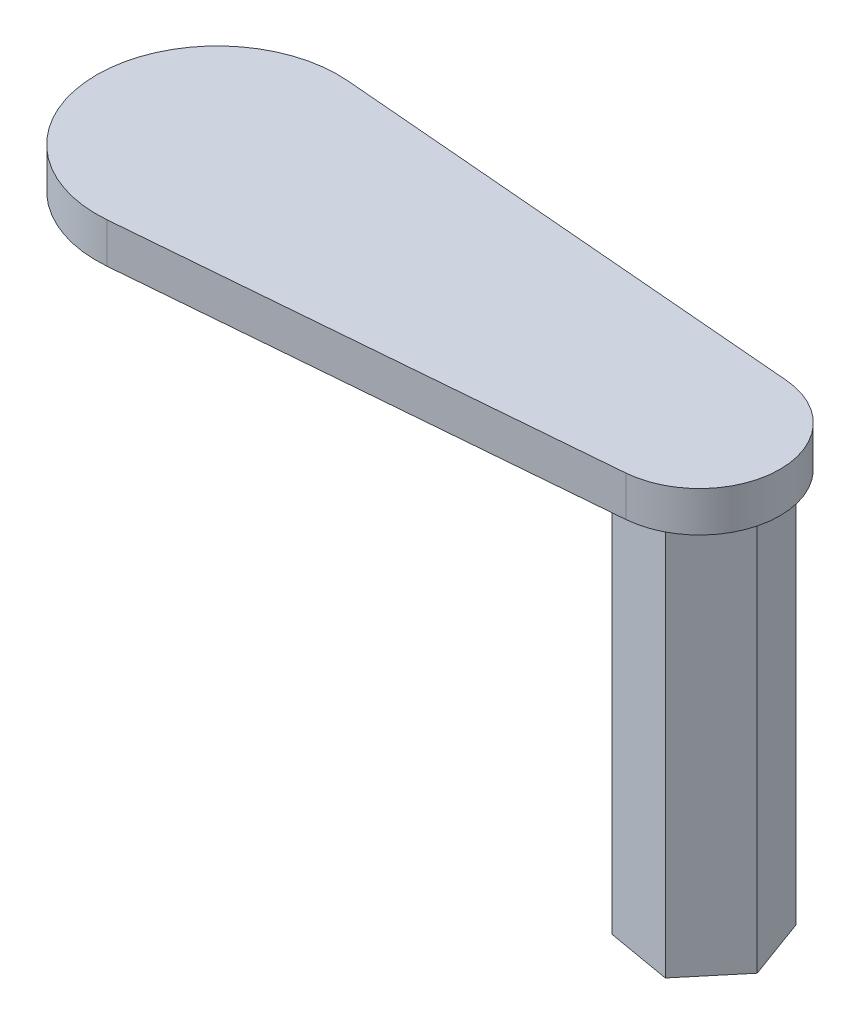
ISO-10303-21;
HEADER;
FILE_DESCRIPTION(('STEP AP214'),'2;1');
FILE_NAME('part.step','',(''),(''),'','','');
FILE_SCHEMA(('AUTOMOTIVE_DESIGN { 1 0 10303 214 1 1 1 1 }'));
ENDSEC;
DATA;
#1=APPLICATION_CONTEXT('core data for automotive mechanical design processes');
#2=APPLICATION_PROTOCOL_DEFINITION('international standard','automotive_design',2000,#1);
#3=PRODUCT_CONTEXT('',#1,'mechanical');
#4=PRODUCT('Part','Part','',(#3));
#5=PRODUCT_RELATED_PRODUCT_CATEGORY('part','',(#4));
#6=PRODUCT_DEFINITION_FORMATION('','',#4);
#7=PRODUCT_DEFINITION_CONTEXT('part definition',#1,'design');
#8=PRODUCT_DEFINITION('design','',#6,#7);
#9=PRODUCT_DEFINITION_SHAPE('','',#8);
#10=(LENGTH_UNIT() NAMED_UNIT(*) SI_UNIT(.MILLI.,.METRE.));
#11=(NAMED_UNIT(*) PLANE_ANGLE_UNIT() SI_UNIT($,.RADIAN.));
#12=(NAMED_UNIT(*) SI_UNIT($,.STERADIAN.) SOLID_ANGLE_UNIT());
#13=UNCERTAINTY_MEASURE_WITH_UNIT(LENGTH_MEASURE(1.E-05),#10,'distance_accuracy_value','');
#14=(GEOMETRIC_REPRESENTATION_CONTEXT(3) GLOBAL_UNCERTAINTY_ASSIGNED_CONTEXT((#13)) GLOBAL_UNIT_ASSIGNED_CONTEXT((#10,
#11,#12)) REPRESENTATION_CONTEXT('',''));
#15=CARTESIAN_POINT('',(0.,0.,0.));
#16=DIRECTION('',(0.,0.,1.));
#17=DIRECTION('',(1.,0.,0.));
#18=AXIS2_PLACEMENT_3D('',#15,#16,#17);
#19=CARTESIAN_POINT('',(0.,0.,0.));
#20=DIRECTION('',(0.,1.,0.));
#21=DIRECTION('',(0.,0.,1.));
#22=AXIS2_PLACEMENT_3D('',#19,#20,#21);
#23=PLANE('',#22);
#24=CARTESIAN_POINT('',(0.,0.,0.));
#25=DIRECTION('',(0.,1.,0.));
#26=DIRECTION('',(0.,0.,1.));
#27=AXIS2_PLACEMENT_3D('',#24,#25,#26);
#28=CIRCLE('',#27,15.);
#29=CARTESIAN_POINT('',(1.25283524217713,0.,-14.9475885632419));
#30=VERTEX_POINT('',#29);
#31=CARTESIAN_POINT('',(1.25283524217713,0.,14.9475885632419));
#32=VERTEX_POINT('',#31);
#33=EDGE_CURVE('E156',#30,#32,#28,.T.);
#34=ORIENTED_EDGE('',*,*,#33,.F.);
#35=DIRECTION('',(0.996505904216124,0.,0.0835223494784752));
#36=VECTOR('',#35,1.);
#37=CARTESIAN_POINT('',(1.25283524217713,0.,-14.9475885632419));
#38=LINE('',#37,#36);
#39=CARTESIAN_POINT('',(60.6994398538871,0.,-9.96505904216124));
#40=VERTEX_POINT('',#39);
#41=EDGE_CURVE('E146',#30,#40,#38,.T.);
#42=ORIENTED_EDGE('',*,*,#41,.T.);
#43=CARTESIAN_POINT('',(59.8642163591023,0.,0.));
#44=DIRECTION('',(0.,1.,0.));
#45=DIRECTION('',(0.,0.,1.));
#46=AXIS2_PLACEMENT_3D('',#43,#44,#45);
#47=CIRCLE('',#46,9.99999999999999);
#48=CARTESIAN_POINT('',(60.6994398538871,0.,9.96505904216125));
#49=VERTEX_POINT('',#48);
#50=EDGE_CURVE('E161',#49,#40,#47,.T.);
#51=ORIENTED_EDGE('',*,*,#50,.F.);
#52=DIRECTION('',(0.996505904216124,0.,-0.0835223494784752));
#53=VECTOR('',#52,1.);
#54=CARTESIAN_POINT('',(1.25283524217713,0.,14.9475885632419));
#55=LINE('',#54,#53);
#56=EDGE_CURVE('E159',#32,#49,#55,.T.);
#57=ORIENTED_EDGE('',*,*,#56,.F.);
#58=EDGE_LOOP('',(#34,#42,#51,#57));
#59=FACE_BOUND('',#58,.T.);
#60=CARTESIAN_POINT('',(0.,0.,0.));
#61=DIRECTION('',(0.,1.,0.));
#62=DIRECTION('',(0.,0.,1.));
#63=AXIS2_PLACEMENT_3D('',#60,#61,#62);
#64=CIRCLE('',#63,8.5);
#65=CARTESIAN_POINT('',(0.,0.,8.5));
#66=VERTEX_POINT('',#65);
#67=EDGE_CURVE('E136',#66,#66,#64,.T.);
#68=ORIENTED_EDGE('',*,*,#67,.T.);
#69=EDGE_LOOP('',(#68));
#70=FACE_BOUND('',#69,.T.);
#71=DIRECTION('',(-0.34448959790477,0.,-0.93879013466025));
#72=VECTOR('',#71,1.);
#73=CARTESIAN_POINT('',(46.2477825898024,0.,-16.9706513097456));
#74=LINE('',#73,#72);
#75=CARTESIAN_POINT('',(54.4721610690567,0.,5.44211652706548));
#76=VERTEX_POINT('',#75);
#77=CARTESIAN_POINT('',(51.6817312187925,0.,-2.16225826631702));
#78=VERTEX_POINT('',#77);
#79=EDGE_CURVE('E132',#76,#78,#74,.T.);
#80=ORIENTED_EDGE('',*,*,#79,.F.);
#81=DIRECTION('',(-0.985260904390375,0.,-0.171058324205109));
#82=VECTOR('',#81,1.);
#83=CARTESIAN_POINT('',(0.676708772487052,0.,-3.89770389887627));
#84=LINE('',#83,#82);
#85=CARTESIAN_POINT('',(62.4529577451561,0.,6.82772078594953));
#86=VERTEX_POINT('',#85);
#87=EDGE_CURVE('E129',#86,#76,#84,.T.);
#88=ORIENTED_EDGE('',*,*,#87,.F.);
#89=DIRECTION('',(-0.640771306485607,0.,0.767731810455141));
#90=VECTOR('',#89,1.);
#91=CARTESIAN_POINT('',(40.1693635044773,0.,33.5265195253534));
#92=LINE('',#91,#90);
#93=CARTESIAN_POINT('',(67.6433245709913,0.,0.608950251451065));
#94=VERTEX_POINT('',#93);
#95=EDGE_CURVE('E346',#94,#86,#92,.T.);
#96=ORIENTED_EDGE('',*,*,#95,.F.);
#97=DIRECTION('',(0.34448959790477,0.,0.93879013466025));
#98=VECTOR('',#97,1.);
#99=CARTESIAN_POINT('',(59.418946091737,0.,-21.80381758536));
#100=LINE('',#99,#98);
#101=CARTESIAN_POINT('',(64.8528947207271,0.,-6.99542454193145));
#102=VERTEX_POINT('',#101);
#103=EDGE_CURVE('E361',#102,#94,#100,.T.);
#104=ORIENTED_EDGE('',*,*,#103,.F.);
#105=DIRECTION('',(0.985260904390375,0.,0.171058324205107));
#106=VECTOR('',#105,1.);
#107=CARTESIAN_POINT('',(3.07664574805803,0.,-17.7208492267572));
#108=LINE('',#107,#106);
#109=CARTESIAN_POINT('',(56.8720980446277,0.,-8.3810288008155));
#110=VERTEX_POINT('',#109);
#111=EDGE_CURVE('E55',#110,#102,#108,.T.);
#112=ORIENTED_EDGE('',*,*,#111,.F.);
#113=DIRECTION('',(0.640771306485605,0.,-0.767731810455143));
#114=VECTOR('',#113,1.);
#115=CARTESIAN_POINT('',(29.3981369781139,0.,24.5365404730868));
#116=LINE('',#115,#114);
#117=EDGE_CURVE('E50',#78,#110,#116,.T.);
#118=ORIENTED_EDGE('',*,*,#117,.F.);
#119=EDGE_LOOP('',(#80,#88,#96,#104,#112,#118));
#120=FACE_BOUND('',#119,.T.);
#121=ADVANCED_FACE('F35',(#59,#70,#120),#23,.F.);
#122=CARTESIAN_POINT('',(0.,5.,0.));
#123=DIRECTION('',(0.,-1.,0.));
#124=DIRECTION('',(0.,0.,-1.));
#125=AXIS2_PLACEMENT_3D('',#122,#123,#124);
#126=CYLINDRICAL_SURFACE('',#125,8.5);
#127=ORIENTED_EDGE('',*,*,#67,.F.);
#128=EDGE_LOOP('',(#127));
#129=FACE_BOUND('',#128,.T.);
#130=CARTESIAN_POINT('',(0.,2.,0.));
#131=DIRECTION('',(0.,1.,0.));
#132=DIRECTION('',(0.,0.,1.));
#133=AXIS2_PLACEMENT_3D('',#130,#131,#132);
#134=CIRCLE('',#133,8.5);
#135=CARTESIAN_POINT('',(0.,2.,8.5));
#136=VERTEX_POINT('',#135);
#137=EDGE_CURVE('E133',#136,#136,#134,.T.);
#138=ORIENTED_EDGE('',*,*,#137,.T.);
#139=EDGE_LOOP('',(#138));
#140=FACE_BOUND('',#139,.T.);
#141=ADVANCED_FACE('F37',(#129,#140),#126,.F.);
#142=CARTESIAN_POINT('',(0.,5.,0.));
#143=DIRECTION('',(0.,-1.,0.));
#144=DIRECTION('',(0.,0.,-1.));
#145=AXIS2_PLACEMENT_3D('',#142,#143,#144);
#146=CYLINDRICAL_SURFACE('',#145,15.);
#147=ORIENTED_EDGE('',*,*,#33,.T.);
#148=DIRECTION('',(0.,-1.,0.));
#149=VECTOR('',#148,1.);
#150=CARTESIAN_POINT('',(1.25283524217713,5.,14.9475885632419));
#151=LINE('',#150,#149);
#152=CARTESIAN_POINT('',(1.25283524217713,5.,14.9475885632419));
#153=VERTEX_POINT('',#152);
#154=EDGE_CURVE('E11',#153,#32,#151,.T.);
#155=ORIENTED_EDGE('',*,*,#154,.F.);
#156=CARTESIAN_POINT('',(0.,5.,0.));
#157=DIRECTION('',(0.,1.,0.));
#158=DIRECTION('',(0.,0.,1.));
#159=AXIS2_PLACEMENT_3D('',#156,#157,#158);
#160=CIRCLE('',#159,15.);
#161=CARTESIAN_POINT('',(1.25283524217713,5.,-14.9475885632419));
#162=VERTEX_POINT('',#161);
#163=EDGE_CURVE('E142',#162,#153,#160,.T.);
#164=ORIENTED_EDGE('',*,*,#163,.F.);
#165=DIRECTION('',(0.,-1.,0.));
#166=VECTOR('',#165,1.);
#167=CARTESIAN_POINT('',(1.25283524217713,5.,-14.9475885632419));
#168=LINE('',#167,#166);
#169=EDGE_CURVE('E153',#162,#30,#168,.T.);
#170=ORIENTED_EDGE('',*,*,#169,.T.);
#171=EDGE_LOOP('',(#147,#155,#164,#170));
#172=FACE_BOUND('',#171,.T.);
#173=ADVANCED_FACE('F189',(#172),#146,.T.);
#174=CARTESIAN_POINT('',(1.25283524217713,5.,14.9475885632419));
#175=DIRECTION('',(-0.0835223494784752,0.,-0.996505904216124));
#176=DIRECTION('',(-0.996505904216124,0.,0.0835223494784752));
#177=AXIS2_PLACEMENT_3D('',#174,#175,#176);
#178=PLANE('',#177);
#179=ORIENTED_EDGE('',*,*,#56,.T.);
#180=DIRECTION('',(0.,-1.,0.));
#181=VECTOR('',#180,1.);
#182=CARTESIAN_POINT('',(60.6994398538871,5.,9.96505904216125));
#183=LINE('',#182,#181);
#184=CARTESIAN_POINT('',(60.6994398538871,5.,9.96505904216125));
#185=VERTEX_POINT('',#184);
#186=EDGE_CURVE('E43',#185,#49,#183,.T.);
#187=ORIENTED_EDGE('',*,*,#186,.F.);
#188=DIRECTION('',(0.996505904216124,0.,-0.0835223494784752));
#189=VECTOR('',#188,1.);
#190=CARTESIAN_POINT('',(1.25283524217713,5.,14.9475885632419));
#191=LINE('',#190,#189);
#192=EDGE_CURVE('E145',#153,#185,#191,.T.);
#193=ORIENTED_EDGE('',*,*,#192,.F.);
#194=ORIENTED_EDGE('',*,*,#154,.T.);
#195=EDGE_LOOP('',(#179,#187,#193,#194));
#196=FACE_BOUND('',#195,.T.);
#197=ADVANCED_FACE('F187',(#196),#178,.F.);
#198=CARTESIAN_POINT('',(59.8642163591023,5.,0.));
#199=DIRECTION('',(0.,-1.,0.));
#200=DIRECTION('',(0.,0.,-1.));
#201=AXIS2_PLACEMENT_3D('',#198,#199,#200);
#202=CYLINDRICAL_SURFACE('',#201,9.99999999999999);
#203=ORIENTED_EDGE('',*,*,#50,.T.);
#204=DIRECTION('',(0.,-1.,0.));
#205=VECTOR('',#204,1.);
#206=CARTESIAN_POINT('',(60.6994398538871,5.,-9.96505904216124));
#207=LINE('',#206,#205);
#208=CARTESIAN_POINT('',(60.6994398538871,5.,-9.96505904216124));
#209=VERTEX_POINT('',#208);
#210=EDGE_CURVE('E167',#209,#40,#207,.T.);
#211=ORIENTED_EDGE('',*,*,#210,.F.);
#212=CARTESIAN_POINT('',(59.8642163591023,5.,0.));
#213=DIRECTION('',(0.,1.,0.));
#214=DIRECTION('',(0.,0.,1.));
#215=AXIS2_PLACEMENT_3D('',#212,#213,#214);
#216=CIRCLE('',#215,9.99999999999999);
#217=EDGE_CURVE('E148',#185,#209,#216,.T.);
#218=ORIENTED_EDGE('',*,*,#217,.F.);
#219=ORIENTED_EDGE('',*,*,#186,.T.);
#220=EDGE_LOOP('',(#203,#211,#218,#219));
#221=FACE_BOUND('',#220,.T.);
#222=ADVANCED_FACE('F173',(#221),#202,.T.);
#223=CARTESIAN_POINT('',(1.25283524217713,5.,-14.9475885632419));
#224=DIRECTION('',(0.0835223494784752,0.,-0.996505904216124));
#225=DIRECTION('',(-0.996505904216124,0.,-0.0835223494784752));
#226=AXIS2_PLACEMENT_3D('',#223,#224,#225);
#227=PLANE('',#226);
#228=ORIENTED_EDGE('',*,*,#41,.F.);
#229=ORIENTED_EDGE('',*,*,#169,.F.);
#230=DIRECTION('',(0.996505904216124,0.,0.0835223494784752));
#231=VECTOR('',#230,1.);
#232=CARTESIAN_POINT('',(1.25283524217713,5.,-14.9475885632419));
#233=LINE('',#232,#231);
#234=EDGE_CURVE('E150',#162,#209,#233,.T.);
#235=ORIENTED_EDGE('',*,*,#234,.T.);
#236=ORIENTED_EDGE('',*,*,#210,.T.);
#237=EDGE_LOOP('',(#228,#229,#235,#236));
#238=FACE_BOUND('',#237,.T.);
#239=ADVANCED_FACE('F181',(#238),#227,.T.);
#240=CARTESIAN_POINT('',(0.,5.,0.));
#241=DIRECTION('',(0.,1.,0.));
#242=DIRECTION('',(0.,0.,1.));
#243=AXIS2_PLACEMENT_3D('',#240,#241,#242);
#244=PLANE('',#243);
#245=ORIENTED_EDGE('',*,*,#163,.T.);
#246=ORIENTED_EDGE('',*,*,#192,.T.);
#247=ORIENTED_EDGE('',*,*,#217,.T.);
#248=ORIENTED_EDGE('',*,*,#234,.F.);
#249=EDGE_LOOP('',(#245,#246,#247,#248));
#250=FACE_BOUND('',#249,.T.);
#251=ADVANCED_FACE('F185',(#250),#244,.T.);
#252=CARTESIAN_POINT('',(0.,2.,0.));
#253=DIRECTION('',(0.,1.,0.));
#254=DIRECTION('',(0.,0.,1.));
#255=AXIS2_PLACEMENT_3D('',#252,#253,#254);
#256=PLANE('',#255);
#257=ORIENTED_EDGE('',*,*,#137,.F.);
#258=EDGE_LOOP('',(#257));
#259=FACE_BOUND('',#258,.T.);
#260=ADVANCED_FACE('F222',(#259),#256,.F.);
#261=CARTESIAN_POINT('',(46.2477825898024,-50.,-16.9706513097456));
#262=DIRECTION('',(0.93879013466025,0.,-0.34448959790477));
#263=DIRECTION('',(-0.34448959790477,0.,-0.93879013466025));
#264=AXIS2_PLACEMENT_3D('',#261,#262,#263);
#265=PLANE('',#264);
#266=ORIENTED_EDGE('',*,*,#79,.T.);
#267=DIRECTION('',(0.,1.,0.));
#268=VECTOR('',#267,1.);
#269=CARTESIAN_POINT('',(51.6817312187925,-50.,-2.16225826631702));
#270=LINE('',#269,#268);
#271=CARTESIAN_POINT('',(51.6817312187925,-50.,-2.16225826631702));
#272=VERTEX_POINT('',#271);
#273=EDGE_CURVE('E113',#272,#78,#270,.T.);
#274=ORIENTED_EDGE('',*,*,#273,.F.);
#275=DIRECTION('',(-0.34448959790477,0.,-0.93879013466025));
#276=VECTOR('',#275,1.);
#277=CARTESIAN_POINT('',(46.2477825898024,-50.,-16.9706513097456));
#278=LINE('',#277,#276);
#279=CARTESIAN_POINT('',(54.4721610690567,-50.,5.44211652706548));
#280=VERTEX_POINT('',#279);
#281=EDGE_CURVE('E120',#280,#272,#278,.T.);
#282=ORIENTED_EDGE('',*,*,#281,.F.);
#283=DIRECTION('',(0.,1.,0.));
#284=VECTOR('',#283,1.);
#285=CARTESIAN_POINT('',(54.4721610690567,-50.,5.44211652706548));
#286=LINE('',#285,#284);
#287=EDGE_CURVE('E342',#280,#76,#286,.T.);
#288=ORIENTED_EDGE('',*,*,#287,.T.);
#289=EDGE_LOOP('',(#266,#274,#282,#288));
#290=FACE_BOUND('',#289,.T.);
#291=ADVANCED_FACE('F131',(#290),#265,.F.);
#292=CARTESIAN_POINT('',(29.3981369781139,-50.,24.5365404730868));
#293=DIRECTION('',(0.767731810455143,0.,0.640771306485605));
#294=DIRECTION('',(0.640771306485605,0.,-0.767731810455143));
#295=AXIS2_PLACEMENT_3D('',#292,#293,#294);
#296=PLANE('',#295);
#297=ORIENTED_EDGE('',*,*,#117,.T.);
#298=DIRECTION('',(0.,1.,0.));
#299=VECTOR('',#298,1.);
#300=CARTESIAN_POINT('',(56.8720980446277,-50.,-8.3810288008155));
#301=LINE('',#300,#299);
#302=CARTESIAN_POINT('',(56.8720980446277,-50.,-8.3810288008155));
#303=VERTEX_POINT('',#302);
#304=EDGE_CURVE('E116',#303,#110,#301,.T.);
#305=ORIENTED_EDGE('',*,*,#304,.F.);
#306=DIRECTION('',(0.640771306485605,0.,-0.767731810455143));
#307=VECTOR('',#306,1.);
#308=CARTESIAN_POINT('',(29.3981369781139,-50.,24.5365404730868));
#309=LINE('',#308,#307);
#310=EDGE_CURVE('E109',#272,#303,#309,.T.);
#311=ORIENTED_EDGE('',*,*,#310,.F.);
#312=ORIENTED_EDGE('',*,*,#273,.T.);
#313=EDGE_LOOP('',(#297,#305,#311,#312));
#314=FACE_BOUND('',#313,.T.);
#315=ADVANCED_FACE('F111',(#314),#296,.F.);
#316=CARTESIAN_POINT('',(3.07664574805803,-50.,-17.7208492267572));
#317=DIRECTION('',(-0.171058324205107,0.,0.985260904390375));
#318=DIRECTION('',(0.985260904390375,0.,0.171058324205107));
#319=AXIS2_PLACEMENT_3D('',#316,#317,#318);
#320=PLANE('',#319);
#321=ORIENTED_EDGE('',*,*,#111,.T.);
#322=DIRECTION('',(0.,1.,0.));
#323=VECTOR('',#322,1.);
#324=CARTESIAN_POINT('',(64.8528947207271,-50.,-6.99542454193145));
#325=LINE('',#324,#323);
#326=CARTESIAN_POINT('',(64.8528947207271,-50.,-6.99542454193145));
#327=VERTEX_POINT('',#326);
#328=EDGE_CURVE('E138',#327,#102,#325,.T.);
#329=ORIENTED_EDGE('',*,*,#328,.F.);
#330=DIRECTION('',(0.985260904390375,0.,0.171058324205107));
#331=VECTOR('',#330,1.);
#332=CARTESIAN_POINT('',(3.07664574805803,-50.,-17.7208492267572));
#333=LINE('',#332,#331);
#334=EDGE_CURVE('E119',#303,#327,#333,.T.);
#335=ORIENTED_EDGE('',*,*,#334,.F.);
#336=ORIENTED_EDGE('',*,*,#304,.T.);
#337=EDGE_LOOP('',(#321,#329,#335,#336));
#338=FACE_BOUND('',#337,.T.);
#339=ADVANCED_FACE('F240',(#338),#320,.F.);
#340=CARTESIAN_POINT('',(59.418946091737,-50.,-21.80381758536));
#341=DIRECTION('',(-0.93879013466025,0.,0.34448959790477));
#342=DIRECTION('',(0.34448959790477,0.,0.93879013466025));
#343=AXIS2_PLACEMENT_3D('',#340,#341,#342);
#344=PLANE('',#343);
#345=ORIENTED_EDGE('',*,*,#103,.T.);
#346=DIRECTION('',(0.,1.,0.));
#347=VECTOR('',#346,1.);
#348=CARTESIAN_POINT('',(67.6433245709913,-50.,0.608950251451072));
#349=LINE('',#348,#347);
#350=CARTESIAN_POINT('',(67.6433245709913,-50.,0.608950251451072));
#351=VERTEX_POINT('',#350);
#352=EDGE_CURVE('E349',#351,#94,#349,.T.);
#353=ORIENTED_EDGE('',*,*,#352,.F.);
#354=DIRECTION('',(0.34448959790477,0.,0.93879013466025));
#355=VECTOR('',#354,1.);
#356=CARTESIAN_POINT('',(59.418946091737,-50.,-21.80381758536));
#357=LINE('',#356,#355);
#358=EDGE_CURVE('E362',#327,#351,#357,.T.);
#359=ORIENTED_EDGE('',*,*,#358,.F.);
#360=ORIENTED_EDGE('',*,*,#328,.T.);
#361=EDGE_LOOP('',(#345,#353,#359,#360));
#362=FACE_BOUND('',#361,.T.);
#363=ADVANCED_FACE('F247',(#362),#344,.F.);
#364=CARTESIAN_POINT('',(40.1693635044773,-50.,33.5265195253534));
#365=DIRECTION('',(-0.767731810455141,0.,-0.640771306485607));
#366=DIRECTION('',(-0.640771306485607,0.,0.767731810455141));
#367=AXIS2_PLACEMENT_3D('',#364,#365,#366);
#368=PLANE('',#367);
#369=ORIENTED_EDGE('',*,*,#95,.T.);
#370=DIRECTION('',(0.,1.,0.));
#371=VECTOR('',#370,1.);
#372=CARTESIAN_POINT('',(62.4529577451561,-50.,6.82772078594953));
#373=LINE('',#372,#371);
#374=CARTESIAN_POINT('',(62.4529577451561,-50.,6.82772078594953));
#375=VERTEX_POINT('',#374);
#376=EDGE_CURVE('E344',#375,#86,#373,.T.);
#377=ORIENTED_EDGE('',*,*,#376,.F.);
#378=DIRECTION('',(-0.640771306485607,0.,0.767731810455141));
#379=VECTOR('',#378,1.);
#380=CARTESIAN_POINT('',(40.1693635044773,-50.,33.5265195253534));
#381=LINE('',#380,#379);
#382=EDGE_CURVE('E351',#351,#375,#381,.T.);
#383=ORIENTED_EDGE('',*,*,#382,.F.);
#384=ORIENTED_EDGE('',*,*,#352,.T.);
#385=EDGE_LOOP('',(#369,#377,#383,#384));
#386=FACE_BOUND('',#385,.T.);
#387=ADVANCED_FACE('F255',(#386),#368,.F.);
#388=CARTESIAN_POINT('',(0.676708772487052,-50.,-3.89770389887627));
#389=DIRECTION('',(0.171058324205109,0.,-0.985260904390375));
#390=DIRECTION('',(-0.985260904390375,0.,-0.171058324205109));
#391=AXIS2_PLACEMENT_3D('',#388,#389,#390);
#392=PLANE('',#391);
#393=ORIENTED_EDGE('',*,*,#87,.T.);
#394=ORIENTED_EDGE('',*,*,#287,.F.);
#395=DIRECTION('',(-0.985260904390375,0.,-0.171058324205109));
#396=VECTOR('',#395,1.);
#397=CARTESIAN_POINT('',(0.676708772487052,-50.,-3.89770389887627));
#398=LINE('',#397,#396);
#399=EDGE_CURVE('E125',#375,#280,#398,.T.);
#400=ORIENTED_EDGE('',*,*,#399,.F.);
#401=ORIENTED_EDGE('',*,*,#376,.T.);
#402=EDGE_LOOP('',(#393,#394,#400,#401));
#403=FACE_BOUND('',#402,.T.);
#404=ADVANCED_FACE('F263',(#403),#392,.F.);
#405=CARTESIAN_POINT('',(0.,-50.,0.));
#406=DIRECTION('',(0.,-1.,0.));
#407=DIRECTION('',(0.,0.,-1.));
#408=AXIS2_PLACEMENT_3D('',#405,#406,#407);
#409=PLANE('',#408);
#410=ORIENTED_EDGE('',*,*,#281,.T.);
#411=ORIENTED_EDGE('',*,*,#310,.T.);
#412=ORIENTED_EDGE('',*,*,#334,.T.);
#413=ORIENTED_EDGE('',*,*,#358,.T.);
#414=ORIENTED_EDGE('',*,*,#382,.T.);
#415=ORIENTED_EDGE('',*,*,#399,.T.);
#416=EDGE_LOOP('',(#410,#411,#412,#413,#414,#415));
#417=FACE_BOUND('',#416,.T.);
#418=ADVANCED_FACE('F123',(#417),#409,.T.);
#419=CLOSED_SHELL('',(#121,#141,#173,#197,#222,#239,#251,#260,#291,#315,#339,#363,#387,#404,#418));
#420=MANIFOLD_SOLID_BREP('B2',#419);
#421=ADVANCED_BREP_SHAPE_REPRESENTATION('',(#18,#420),#14);
#422=SHAPE_DEFINITION_REPRESENTATION(#9,#421);
ENDSEC;
END-ISO-10303-21;
